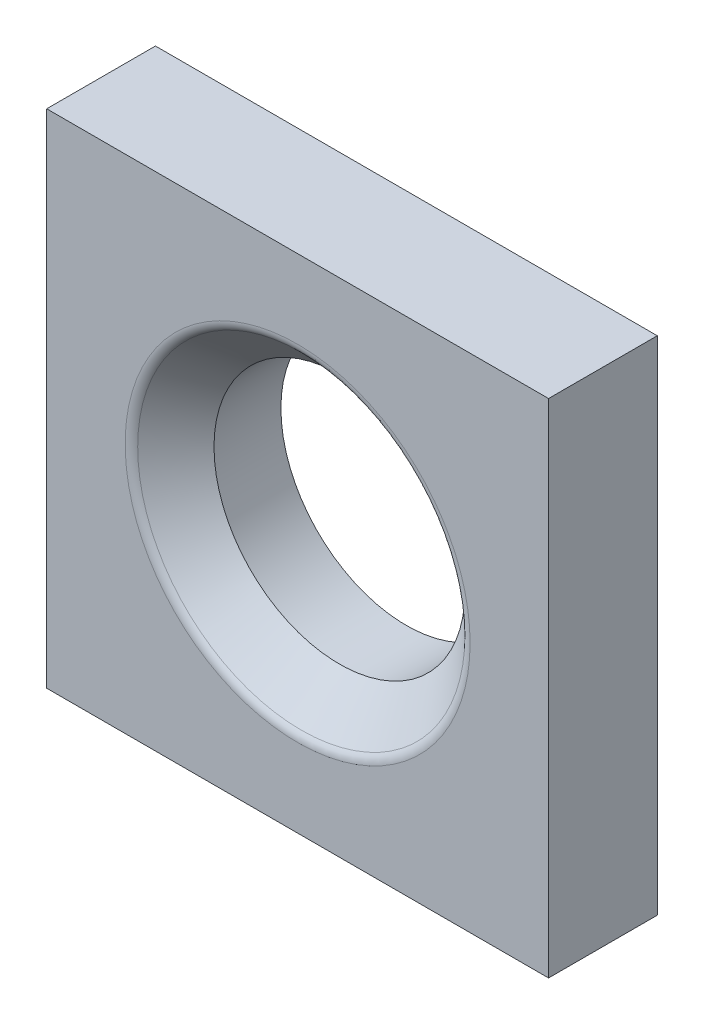
ISO-10303-21;
HEADER;
FILE_DESCRIPTION(('STEP AP214'),'2;1');
FILE_NAME('part.step','',(''),(''),'','','');
FILE_SCHEMA(('AUTOMOTIVE_DESIGN { 1 0 10303 214 1 1 1 1 }'));
ENDSEC;
DATA;
#1=APPLICATION_CONTEXT('core data for automotive mechanical design processes');
#2=APPLICATION_PROTOCOL_DEFINITION('international standard','automotive_design',2000,#1);
#3=PRODUCT_CONTEXT('',#1,'mechanical');
#4=PRODUCT('Part','Part','',(#3));
#5=PRODUCT_RELATED_PRODUCT_CATEGORY('part','',(#4));
#6=PRODUCT_DEFINITION_FORMATION('','',#4);
#7=PRODUCT_DEFINITION_CONTEXT('part definition',#1,'design');
#8=PRODUCT_DEFINITION('design','',#6,#7);
#9=PRODUCT_DEFINITION_SHAPE('','',#8);
#10=(LENGTH_UNIT() NAMED_UNIT(*) SI_UNIT(.MILLI.,.METRE.));
#11=(NAMED_UNIT(*) PLANE_ANGLE_UNIT() SI_UNIT($,.RADIAN.));
#12=(NAMED_UNIT(*) SI_UNIT($,.STERADIAN.) SOLID_ANGLE_UNIT());
#13=UNCERTAINTY_MEASURE_WITH_UNIT(LENGTH_MEASURE(1.E-05),#10,'distance_accuracy_value','');
#14=(GEOMETRIC_REPRESENTATION_CONTEXT(3) GLOBAL_UNCERTAINTY_ASSIGNED_CONTEXT((#13)) GLOBAL_UNIT_ASSIGNED_CONTEXT((#10,
#11,#12)) REPRESENTATION_CONTEXT('',''));
#15=CARTESIAN_POINT('',(0.,0.,0.));
#16=DIRECTION('',(0.,0.,1.));
#17=DIRECTION('',(1.,0.,0.));
#18=AXIS2_PLACEMENT_3D('',#15,#16,#17);
#19=CARTESIAN_POINT('',(0.,0.,13.));
#20=DIRECTION('',(0.,0.,1.));
#21=DIRECTION('',(1.,0.,0.));
#22=AXIS2_PLACEMENT_3D('',#19,#20,#21);
#23=PLANE('',#22);
#24=CARTESIAN_POINT('',(0.,0.,13.));
#25=DIRECTION('',(0.,0.,1.));
#26=DIRECTION('',(1.,0.,0.));
#27=AXIS2_PLACEMENT_3D('',#24,#25,#26);
#28=CIRCLE('',#27,20.6213203435597);
#29=CARTESIAN_POINT('',(20.6213203435597,0.,13.));
#30=VERTEX_POINT('',#29);
#31=EDGE_CURVE('E57',#30,#30,#28,.F.);
#32=ORIENTED_EDGE('',*,*,#31,.T.);
#33=EDGE_LOOP('',(#32));
#34=FACE_BOUND('',#33,.T.);
#35=DIRECTION('',(0.,-1.,0.));
#36=VECTOR('',#35,1.);
#37=CARTESIAN_POINT('',(-30.,-30.,13.));
#38=LINE('',#37,#36);
#39=CARTESIAN_POINT('',(-30.,30.,13.));
#40=VERTEX_POINT('',#39);
#41=CARTESIAN_POINT('',(-30.,-30.,13.));
#42=VERTEX_POINT('',#41);
#43=EDGE_CURVE('E100',#40,#42,#38,.T.);
#44=ORIENTED_EDGE('',*,*,#43,.T.);
#45=DIRECTION('',(1.,0.,0.));
#46=VECTOR('',#45,1.);
#47=CARTESIAN_POINT('',(30.,-30.,13.));
#48=LINE('',#47,#46);
#49=CARTESIAN_POINT('',(30.,-30.,13.));
#50=VERTEX_POINT('',#49);
#51=EDGE_CURVE('E96',#42,#50,#48,.T.);
#52=ORIENTED_EDGE('',*,*,#51,.T.);
#53=DIRECTION('',(0.,1.,0.));
#54=VECTOR('',#53,1.);
#55=CARTESIAN_POINT('',(30.,-30.,13.));
#56=LINE('',#55,#54);
#57=CARTESIAN_POINT('',(30.,30.,13.));
#58=VERTEX_POINT('',#57);
#59=EDGE_CURVE('E98',#50,#58,#56,.T.);
#60=ORIENTED_EDGE('',*,*,#59,.T.);
#61=DIRECTION('',(-1.,0.,0.));
#62=VECTOR('',#61,1.);
#63=CARTESIAN_POINT('',(30.,30.,13.));
#64=LINE('',#63,#62);
#65=EDGE_CURVE('E65',#58,#40,#64,.T.);
#66=ORIENTED_EDGE('',*,*,#65,.T.);
#67=EDGE_LOOP('',(#44,#52,#60,#66));
#68=FACE_BOUND('',#67,.T.);
#69=ADVANCED_FACE('F47',(#34,#68),#23,.T.);
#70=CARTESIAN_POINT('',(0.,0.,0.));
#71=DIRECTION('',(0.,0.,1.));
#72=DIRECTION('',(1.,0.,0.));
#73=AXIS2_PLACEMENT_3D('',#70,#71,#72);
#74=PLANE('',#73);
#75=DIRECTION('',(0.,-1.,0.));
#76=VECTOR('',#75,1.);
#77=CARTESIAN_POINT('',(-30.,-30.,0.));
#78=LINE('',#77,#76);
#79=CARTESIAN_POINT('',(-30.,30.,0.));
#80=VERTEX_POINT('',#79);
#81=CARTESIAN_POINT('',(-30.,-30.,0.));
#82=VERTEX_POINT('',#81);
#83=EDGE_CURVE('E119',#80,#82,#78,.T.);
#84=ORIENTED_EDGE('',*,*,#83,.F.);
#85=DIRECTION('',(-1.,0.,0.));
#86=VECTOR('',#85,1.);
#87=CARTESIAN_POINT('',(30.,30.,0.));
#88=LINE('',#87,#86);
#89=CARTESIAN_POINT('',(30.,30.,0.));
#90=VERTEX_POINT('',#89);
#91=EDGE_CURVE('E88',#90,#80,#88,.T.);
#92=ORIENTED_EDGE('',*,*,#91,.F.);
#93=DIRECTION('',(0.,1.,0.));
#94=VECTOR('',#93,1.);
#95=CARTESIAN_POINT('',(30.,-30.,0.));
#96=LINE('',#95,#94);
#97=CARTESIAN_POINT('',(30.,-30.,0.));
#98=VERTEX_POINT('',#97);
#99=EDGE_CURVE('E82',#98,#90,#96,.T.);
#100=ORIENTED_EDGE('',*,*,#99,.F.);
#101=DIRECTION('',(1.,0.,0.));
#102=VECTOR('',#101,1.);
#103=CARTESIAN_POINT('',(30.,-30.,0.));
#104=LINE('',#103,#102);
#105=EDGE_CURVE('E106',#82,#98,#104,.T.);
#106=ORIENTED_EDGE('',*,*,#105,.F.);
#107=EDGE_LOOP('',(#84,#92,#100,#106));
#108=FACE_BOUND('',#107,.T.);
#109=CARTESIAN_POINT('',(0.,0.,0.));
#110=DIRECTION('',(0.,0.,1.));
#111=DIRECTION('',(1.,0.,0.));
#112=AXIS2_PLACEMENT_3D('',#109,#110,#111);
#113=CIRCLE('',#112,15.);
#114=CARTESIAN_POINT('',(-15.,0.,0.));
#115=VERTEX_POINT('',#114);
#116=EDGE_CURVE('E123',#115,#115,#113,.T.);
#117=ORIENTED_EDGE('',*,*,#116,.T.);
#118=EDGE_LOOP('',(#117));
#119=FACE_BOUND('',#118,.T.);
#120=ADVANCED_FACE('F154',(#108,#119),#74,.F.);
#121=CARTESIAN_POINT('',(-30.,-30.,13.));
#122=DIRECTION('',(1.,0.,0.));
#123=DIRECTION('',(0.,0.,-1.));
#124=AXIS2_PLACEMENT_3D('',#121,#122,#123);
#125=PLANE('',#124);
#126=ORIENTED_EDGE('',*,*,#83,.T.);
#127=DIRECTION('',(0.,0.,-1.));
#128=VECTOR('',#127,1.);
#129=CARTESIAN_POINT('',(-30.,-30.,13.));
#130=LINE('',#129,#128);
#131=EDGE_CURVE('E108',#42,#82,#130,.T.);
#132=ORIENTED_EDGE('',*,*,#131,.F.);
#133=ORIENTED_EDGE('',*,*,#43,.F.);
#134=DIRECTION('',(0.,0.,-1.));
#135=VECTOR('',#134,1.);
#136=CARTESIAN_POINT('',(-30.,30.,13.));
#137=LINE('',#136,#135);
#138=EDGE_CURVE('E115',#40,#80,#137,.T.);
#139=ORIENTED_EDGE('',*,*,#138,.T.);
#140=EDGE_LOOP('',(#126,#132,#133,#139));
#141=FACE_BOUND('',#140,.T.);
#142=ADVANCED_FACE('F160',(#141),#125,.F.);
#143=CARTESIAN_POINT('',(30.,-30.,13.));
#144=DIRECTION('',(0.,1.,0.));
#145=DIRECTION('',(-1.,0.,0.));
#146=AXIS2_PLACEMENT_3D('',#143,#144,#145);
#147=PLANE('',#146);
#148=ORIENTED_EDGE('',*,*,#105,.T.);
#149=DIRECTION('',(0.,0.,-1.));
#150=VECTOR('',#149,1.);
#151=CARTESIAN_POINT('',(30.,-30.,13.));
#152=LINE('',#151,#150);
#153=EDGE_CURVE('E104',#50,#98,#152,.T.);
#154=ORIENTED_EDGE('',*,*,#153,.F.);
#155=ORIENTED_EDGE('',*,*,#51,.F.);
#156=ORIENTED_EDGE('',*,*,#131,.T.);
#157=EDGE_LOOP('',(#148,#154,#155,#156));
#158=FACE_BOUND('',#157,.T.);
#159=ADVANCED_FACE('F105',(#158),#147,.F.);
#160=CARTESIAN_POINT('',(30.,-30.,13.));
#161=DIRECTION('',(-1.,0.,0.));
#162=DIRECTION('',(0.,-1.,0.));
#163=AXIS2_PLACEMENT_3D('',#160,#161,#162);
#164=PLANE('',#163);
#165=ORIENTED_EDGE('',*,*,#99,.T.);
#166=DIRECTION('',(0.,0.,-1.));
#167=VECTOR('',#166,1.);
#168=CARTESIAN_POINT('',(30.,30.,13.));
#169=LINE('',#168,#167);
#170=EDGE_CURVE('E109',#58,#90,#169,.T.);
#171=ORIENTED_EDGE('',*,*,#170,.F.);
#172=ORIENTED_EDGE('',*,*,#59,.F.);
#173=ORIENTED_EDGE('',*,*,#153,.T.);
#174=EDGE_LOOP('',(#165,#171,#172,#173));
#175=FACE_BOUND('',#174,.T.);
#176=ADVANCED_FACE('F111',(#175),#164,.F.);
#177=CARTESIAN_POINT('',(30.,30.,13.));
#178=DIRECTION('',(0.,-1.,0.));
#179=DIRECTION('',(1.,0.,0.));
#180=AXIS2_PLACEMENT_3D('',#177,#178,#179);
#181=PLANE('',#180);
#182=ORIENTED_EDGE('',*,*,#91,.T.);
#183=ORIENTED_EDGE('',*,*,#138,.F.);
#184=ORIENTED_EDGE('',*,*,#65,.F.);
#185=ORIENTED_EDGE('',*,*,#170,.T.);
#186=EDGE_LOOP('',(#182,#183,#184,#185));
#187=FACE_BOUND('',#186,.T.);
#188=ADVANCED_FACE('F165',(#187),#181,.F.);
#189=CARTESIAN_POINT('',(0.,0.,13.));
#190=DIRECTION('',(0.,0.,-1.));
#191=DIRECTION('',(-1.,0.,0.));
#192=AXIS2_PLACEMENT_3D('',#189,#190,#191);
#193=CYLINDRICAL_SURFACE('',#192,15.);
#194=CARTESIAN_POINT('',(0.,0.,7.99999999999996));
#195=DIRECTION('',(0.,0.,1.));
#196=DIRECTION('',(1.,0.,0.));
#197=AXIS2_PLACEMENT_3D('',#194,#195,#196);
#198=CIRCLE('',#197,15.);
#199=CARTESIAN_POINT('',(-15.,0.,7.99999999999995));
#200=VERTEX_POINT('',#199);
#201=EDGE_CURVE('E136',#200,#200,#198,.T.);
#202=CARTESIAN_POINT('',(-15.,0.,7.99999999999995));
#203=CARTESIAN_POINT('',(-15.,0.,7.91666666666662));
#204=CARTESIAN_POINT('',(-15.,0.,7.83333333333329));
#205=CARTESIAN_POINT('',(-15.,0.,7.66666666666662));
#206=CARTESIAN_POINT('',(-15.,0.,7.58333333333329));
#207=CARTESIAN_POINT('',(-15.,0.,7.41666666666663));
#208=CARTESIAN_POINT('',(-15.,0.,7.33333333333329));
#209=CARTESIAN_POINT('',(-15.,0.,7.16666666666663));
#210=CARTESIAN_POINT('',(-15.,0.,7.08333333333329));
#211=CARTESIAN_POINT('',(-15.,0.,6.91666666666663));
#212=CARTESIAN_POINT('',(-15.,0.,6.8333333333333));
#213=CARTESIAN_POINT('',(-15.,0.,6.66666666666663));
#214=CARTESIAN_POINT('',(-15.,0.,6.5833333333333));
#215=CARTESIAN_POINT('',(-15.,0.,6.41666666666663));
#216=CARTESIAN_POINT('',(-15.,0.,6.3333333333333));
#217=CARTESIAN_POINT('',(-15.,0.,6.16666666666663));
#218=CARTESIAN_POINT('',(-15.,0.,6.0833333333333));
#219=CARTESIAN_POINT('',(-15.,0.,5.91666666666663));
#220=CARTESIAN_POINT('',(-15.,0.,5.8333333333333));
#221=CARTESIAN_POINT('',(-15.,0.,5.66666666666663));
#222=CARTESIAN_POINT('',(-15.,0.,5.5833333333333));
#223=CARTESIAN_POINT('',(-15.,0.,5.41666666666664));
#224=CARTESIAN_POINT('',(-15.,0.,5.3333333333333));
#225=CARTESIAN_POINT('',(-15.,0.,5.16666666666664));
#226=CARTESIAN_POINT('',(-15.,0.,5.08333333333331));
#227=CARTESIAN_POINT('',(-15.,0.,4.91666666666664));
#228=CARTESIAN_POINT('',(-15.,0.,4.83333333333331));
#229=CARTESIAN_POINT('',(-15.,0.,4.66666666666664));
#230=CARTESIAN_POINT('',(-15.,0.,4.58333333333331));
#231=CARTESIAN_POINT('',(-15.,0.,4.41666666666664));
#232=CARTESIAN_POINT('',(-15.,0.,4.33333333333331));
#233=CARTESIAN_POINT('',(-15.,0.,4.16666666666664));
#234=CARTESIAN_POINT('',(-15.,0.,4.08333333333331));
#235=CARTESIAN_POINT('',(-15.,0.,3.91666666666665));
#236=CARTESIAN_POINT('',(-15.,0.,3.83333333333331));
#237=CARTESIAN_POINT('',(-15.,0.,3.66666666666665));
#238=CARTESIAN_POINT('',(-15.,0.,3.58333333333331));
#239=CARTESIAN_POINT('',(-15.,0.,3.41666666666665));
#240=CARTESIAN_POINT('',(-15.,0.,3.33333333333332));
#241=CARTESIAN_POINT('',(-15.,0.,3.16666666666665));
#242=CARTESIAN_POINT('',(-15.,0.,3.08333333333332));
#243=CARTESIAN_POINT('',(-15.,0.,2.91666666666665));
#244=CARTESIAN_POINT('',(-15.,0.,2.83333333333332));
#245=CARTESIAN_POINT('',(-15.,0.,2.66666666666665));
#246=CARTESIAN_POINT('',(-15.,0.,2.58333333333332));
#247=CARTESIAN_POINT('',(-15.,0.,2.41666666666665));
#248=CARTESIAN_POINT('',(-15.,0.,2.33333333333332));
#249=CARTESIAN_POINT('',(-15.,0.,2.16666666666666));
#250=CARTESIAN_POINT('',(-15.,0.,2.08333333333332));
#251=CARTESIAN_POINT('',(-15.,0.,1.91666666666666));
#252=CARTESIAN_POINT('',(-15.,0.,1.83333333333332));
#253=CARTESIAN_POINT('',(-15.,0.,1.66666666666666));
#254=CARTESIAN_POINT('',(-15.,0.,1.58333333333332));
#255=CARTESIAN_POINT('',(-15.,0.,1.41666666666666));
#256=CARTESIAN_POINT('',(-15.,0.,1.33333333333333));
#257=CARTESIAN_POINT('',(-15.,0.,1.16666666666666));
#258=CARTESIAN_POINT('',(-15.,0.,1.08333333333333));
#259=CARTESIAN_POINT('',(-15.,0.,0.916666666666662));
#260=CARTESIAN_POINT('',(-15.,0.,0.833333333333329));
#261=CARTESIAN_POINT('',(-15.,0.,0.666666666666664));
#262=CARTESIAN_POINT('',(-15.,0.,0.58333333333333));
#263=CARTESIAN_POINT('',(-15.,0.,0.416666666666664));
#264=CARTESIAN_POINT('',(-15.,0.,0.333333333333331));
#265=CARTESIAN_POINT('',(-15.,0.,0.166666666666666));
#266=CARTESIAN_POINT('',(-15.,0.,0.0833333333333327));
#267=CARTESIAN_POINT('',(-15.,0.,0.));
#268=B_SPLINE_CURVE_WITH_KNOTS('',3,(#202,#203,#204,#205,#206,#207,#208,#209,#210,#211,#212,
#213,#214,#215,#216,#217,#218,#219,#220,#221,#222,#223,#224,#225,#226,#227,#228,#229,#230,#231,
#232,#233,#234,#235,#236,#237,#238,#239,#240,#241,#242,#243,#244,#245,#246,#247,#248,#249,#250,
#251,#252,#253,#254,#255,#256,#257,#258,#259,#260,#261,#262,#263,#264,#265,#266,#267),
.UNSPECIFIED.,.F.,.F.,(4,2,2,2,2,2,2,2,2,2,2,2,2,2,2,2,2,2,2,2,2,2,2,2,2,2,2,2,2,2,2,2,4),(0.,
0.249999999999998,0.499999999999996,0.749999999999995,0.999999999999994,1.24999999999999,
1.49999999999999,1.74999999999999,1.99999999999999,2.24999999999999,2.49999999999999,
2.74999999999998,2.99999999999998,3.24999999999998,3.49999999999998,3.74999999999998,
3.99999999999998,4.24999999999998,4.49999999999997,4.74999999999997,4.99999999999997,
5.24999999999997,5.49999999999997,5.74999999999997,5.99999999999997,6.24999999999996,
6.49999999999996,6.74999999999996,6.99999999999996,7.24999999999996,7.49999999999996,
7.74999999999996,7.99999999999995),.UNSPECIFIED.);
#269=EDGE_CURVE('BSEAM150',#200,#115,#268,.T.);
#270=ORIENTED_EDGE('',*,*,#201,.T.);
#271=ORIENTED_EDGE('',*,*,#116,.F.);
#272=ORIENTED_EDGE('',*,*,#269,.T.);
#273=ORIENTED_EDGE('',*,*,#269,.F.);
#274=EDGE_LOOP('',(#270,#272,#271,#273));
#275=FACE_BOUND('',#274,.T.);
#276=ADVANCED_FACE('F150',(#275),#193,.F.);
#277=CARTESIAN_POINT('',(0.,0.,7.99999999999996));
#278=DIRECTION('',(0.,0.,1.));
#279=DIRECTION('',(1.,0.,0.));
#280=AXIS2_PLACEMENT_3D('',#277,#278,#279);
#281=CONICAL_SURFACE('',#280,15.,0.78539816339745);
#282=CARTESIAN_POINT('',(0.,0.,12.5606601717798));
#283=DIRECTION('',(0.,0.,-1.));
#284=DIRECTION('',(-1.,0.,0.));
#285=AXIS2_PLACEMENT_3D('',#282,#283,#284);
#286=CIRCLE('',#285,19.5606601717799);
#287=CARTESIAN_POINT('',(-19.5606601717799,0.,12.5606601717798));
#288=VERTEX_POINT('',#287);
#289=EDGE_CURVE('E11',#288,#288,#286,.F.);
#290=ORIENTED_EDGE('',*,*,#289,.T.);
#291=EDGE_LOOP('',(#290));
#292=FACE_BOUND('',#291,.T.);
#293=ORIENTED_EDGE('',*,*,#201,.F.);
#294=EDGE_LOOP('',(#293));
#295=FACE_BOUND('',#294,.T.);
#296=ADVANCED_FACE('F145',(#292,#295),#281,.F.);
#297=CARTESIAN_POINT('',(0.,0.,11.5));
#298=DIRECTION('',(0.,0.,1.));
#299=DIRECTION('',(1.,0.,0.));
#300=AXIS2_PLACEMENT_3D('',#297,#298,#299);
#301=TOROIDAL_SURFACE('',#300,20.6213203435597,1.5);
#302=ORIENTED_EDGE('',*,*,#289,.F.);
#303=EDGE_LOOP('',(#302));
#304=FACE_BOUND('',#303,.T.);
#305=ORIENTED_EDGE('',*,*,#31,.F.);
#306=EDGE_LOOP('',(#305));
#307=FACE_BOUND('',#306,.T.);
#308=ADVANCED_FACE('F49',(#304,#307),#301,.T.);
#309=CLOSED_SHELL('',(#69,#120,#142,#159,#176,#188,#276,#296,#308));
#310=MANIFOLD_SOLID_BREP('B2',#309);
#311=ADVANCED_BREP_SHAPE_REPRESENTATION('',(#18,#310),#14);
#312=SHAPE_DEFINITION_REPRESENTATION(#9,#311);
ENDSEC;
END-ISO-10303-21;
